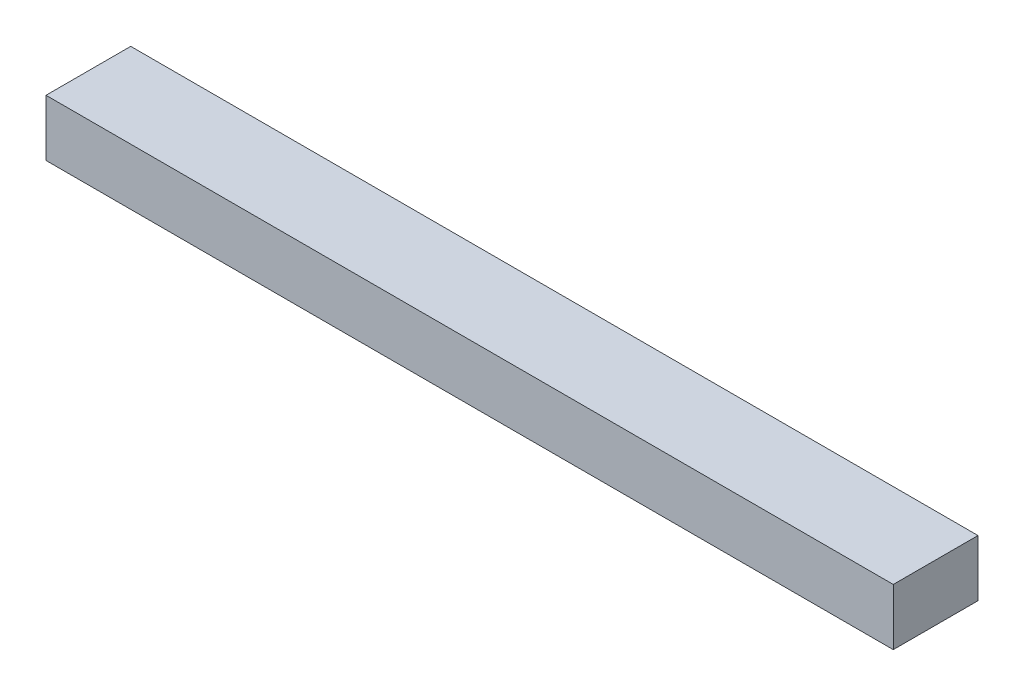
ISO-10303-21;
HEADER;
FILE_DESCRIPTION(('STEP AP214'),'2;1');
FILE_NAME('part.step','',(''),(''),'','','');
FILE_SCHEMA(('AUTOMOTIVE_DESIGN { 1 0 10303 214 1 1 1 1 }'));
ENDSEC;
DATA;
#1=APPLICATION_CONTEXT('core data for automotive mechanical design processes');
#2=APPLICATION_PROTOCOL_DEFINITION('international standard','automotive_design',2000,#1);
#3=PRODUCT_CONTEXT('',#1,'mechanical');
#4=PRODUCT('Part','Part','',(#3));
#5=PRODUCT_RELATED_PRODUCT_CATEGORY('part','',(#4));
#6=PRODUCT_DEFINITION_FORMATION('','',#4);
#7=PRODUCT_DEFINITION_CONTEXT('part definition',#1,'design');
#8=PRODUCT_DEFINITION('design','',#6,#7);
#9=PRODUCT_DEFINITION_SHAPE('','',#8);
#10=(LENGTH_UNIT() NAMED_UNIT(*) SI_UNIT(.MILLI.,.METRE.));
#11=(NAMED_UNIT(*) PLANE_ANGLE_UNIT() SI_UNIT($,.RADIAN.));
#12=(NAMED_UNIT(*) SI_UNIT($,.STERADIAN.) SOLID_ANGLE_UNIT());
#13=UNCERTAINTY_MEASURE_WITH_UNIT(LENGTH_MEASURE(1.E-05),#10,'distance_accuracy_value','');
#14=(GEOMETRIC_REPRESENTATION_CONTEXT(3) GLOBAL_UNCERTAINTY_ASSIGNED_CONTEXT((#13)) GLOBAL_UNIT_ASSIGNED_CONTEXT((#10,
#11,#12)) REPRESENTATION_CONTEXT('',''));
#15=CARTESIAN_POINT('',(0.,0.,0.));
#16=DIRECTION('',(0.,0.,1.));
#17=DIRECTION('',(1.,0.,0.));
#18=AXIS2_PLACEMENT_3D('',#15,#16,#17);
#19=CARTESIAN_POINT('',(0.,12.7,0.));
#20=DIRECTION('',(1.,0.,0.));
#21=DIRECTION('',(0.,0.,-1.));
#22=AXIS2_PLACEMENT_3D('',#19,#20,#21);
#23=PLANE('',#22);
#24=DIRECTION('',(0.,0.,1.));
#25=VECTOR('',#24,1.);
#26=CARTESIAN_POINT('',(0.,0.,0.));
#27=LINE('',#26,#25);
#28=CARTESIAN_POINT('',(0.,0.,-19.05));
#29=VERTEX_POINT('',#28);
#30=CARTESIAN_POINT('',(0.,0.,0.));
#31=VERTEX_POINT('',#30);
#32=EDGE_CURVE('E97',#29,#31,#27,.T.);
#33=ORIENTED_EDGE('',*,*,#32,.T.);
#34=DIRECTION('',(0.,-1.,0.));
#35=VECTOR('',#34,1.);
#36=CARTESIAN_POINT('',(0.,12.7,0.));
#37=LINE('',#36,#35);
#38=CARTESIAN_POINT('',(0.,12.7,0.));
#39=VERTEX_POINT('',#38);
#40=EDGE_CURVE('E11',#39,#31,#37,.T.);
#41=ORIENTED_EDGE('',*,*,#40,.F.);
#42=DIRECTION('',(0.,0.,1.));
#43=VECTOR('',#42,1.);
#44=CARTESIAN_POINT('',(0.,12.7,0.));
#45=LINE('',#44,#43);
#46=CARTESIAN_POINT('',(0.,12.7,-19.05));
#47=VERTEX_POINT('',#46);
#48=EDGE_CURVE('E85',#47,#39,#45,.T.);
#49=ORIENTED_EDGE('',*,*,#48,.F.);
#50=DIRECTION('',(0.,-1.,0.));
#51=VECTOR('',#50,1.);
#52=CARTESIAN_POINT('',(0.,12.7,-19.05));
#53=LINE('',#52,#51);
#54=EDGE_CURVE('E93',#47,#29,#53,.T.);
#55=ORIENTED_EDGE('',*,*,#54,.T.);
#56=EDGE_LOOP('',(#33,#41,#49,#55));
#57=FACE_BOUND('',#56,.T.);
#58=ADVANCED_FACE('F34',(#57),#23,.F.);
#59=CARTESIAN_POINT('',(0.,12.7,0.));
#60=DIRECTION('',(0.,0.,-1.));
#61=DIRECTION('',(-1.,0.,0.));
#62=AXIS2_PLACEMENT_3D('',#59,#60,#61);
#63=PLANE('',#62);
#64=DIRECTION('',(1.,0.,0.));
#65=VECTOR('',#64,1.);
#66=CARTESIAN_POINT('',(0.,0.,0.));
#67=LINE('',#66,#65);
#68=CARTESIAN_POINT('',(190.5,0.,0.));
#69=VERTEX_POINT('',#68);
#70=EDGE_CURVE('E89',#31,#69,#67,.T.);
#71=ORIENTED_EDGE('',*,*,#70,.T.);
#72=DIRECTION('',(0.,-1.,0.));
#73=VECTOR('',#72,1.);
#74=CARTESIAN_POINT('',(190.5,12.7,0.));
#75=LINE('',#74,#73);
#76=CARTESIAN_POINT('',(190.5,12.7,0.));
#77=VERTEX_POINT('',#76);
#78=EDGE_CURVE('E42',#77,#69,#75,.T.);
#79=ORIENTED_EDGE('',*,*,#78,.F.);
#80=DIRECTION('',(1.,0.,0.));
#81=VECTOR('',#80,1.);
#82=CARTESIAN_POINT('',(0.,12.7,0.));
#83=LINE('',#82,#81);
#84=EDGE_CURVE('E80',#39,#77,#83,.T.);
#85=ORIENTED_EDGE('',*,*,#84,.F.);
#86=ORIENTED_EDGE('',*,*,#40,.T.);
#87=EDGE_LOOP('',(#71,#79,#85,#86));
#88=FACE_BOUND('',#87,.T.);
#89=ADVANCED_FACE('F88',(#88),#63,.F.);
#90=CARTESIAN_POINT('',(190.5,12.7,0.));
#91=DIRECTION('',(-1.,0.,0.));
#92=DIRECTION('',(0.,0.,1.));
#93=AXIS2_PLACEMENT_3D('',#90,#91,#92);
#94=PLANE('',#93);
#95=DIRECTION('',(0.,0.,-1.));
#96=VECTOR('',#95,1.);
#97=CARTESIAN_POINT('',(190.5,0.,0.));
#98=LINE('',#97,#96);
#99=CARTESIAN_POINT('',(190.5,0.,-19.05));
#100=VERTEX_POINT('',#99);
#101=EDGE_CURVE('E67',#69,#100,#98,.T.);
#102=ORIENTED_EDGE('',*,*,#101,.T.);
#103=DIRECTION('',(0.,-1.,0.));
#104=VECTOR('',#103,1.);
#105=CARTESIAN_POINT('',(190.5,12.7,-19.05));
#106=LINE('',#105,#104);
#107=CARTESIAN_POINT('',(190.5,12.7,-19.05));
#108=VERTEX_POINT('',#107);
#109=EDGE_CURVE('E90',#108,#100,#106,.T.);
#110=ORIENTED_EDGE('',*,*,#109,.F.);
#111=DIRECTION('',(0.,0.,-1.));
#112=VECTOR('',#111,1.);
#113=CARTESIAN_POINT('',(190.5,12.7,0.));
#114=LINE('',#113,#112);
#115=EDGE_CURVE('E83',#77,#108,#114,.T.);
#116=ORIENTED_EDGE('',*,*,#115,.F.);
#117=ORIENTED_EDGE('',*,*,#78,.T.);
#118=EDGE_LOOP('',(#102,#110,#116,#117));
#119=FACE_BOUND('',#118,.T.);
#120=ADVANCED_FACE('F91',(#119),#94,.F.);
#121=CARTESIAN_POINT('',(0.,12.7,-19.05));
#122=DIRECTION('',(0.,0.,1.));
#123=DIRECTION('',(1.,0.,0.));
#124=AXIS2_PLACEMENT_3D('',#121,#122,#123);
#125=PLANE('',#124);
#126=DIRECTION('',(-1.,0.,0.));
#127=VECTOR('',#126,1.);
#128=CARTESIAN_POINT('',(0.,0.,-19.05));
#129=LINE('',#128,#127);
#130=EDGE_CURVE('E73',#100,#29,#129,.T.);
#131=ORIENTED_EDGE('',*,*,#130,.T.);
#132=ORIENTED_EDGE('',*,*,#54,.F.);
#133=DIRECTION('',(-1.,0.,0.));
#134=VECTOR('',#133,1.);
#135=CARTESIAN_POINT('',(0.,12.7,-19.05));
#136=LINE('',#135,#134);
#137=EDGE_CURVE('E50',#108,#47,#136,.T.);
#138=ORIENTED_EDGE('',*,*,#137,.F.);
#139=ORIENTED_EDGE('',*,*,#109,.T.);
#140=EDGE_LOOP('',(#131,#132,#138,#139));
#141=FACE_BOUND('',#140,.T.);
#142=ADVANCED_FACE('F104',(#141),#125,.F.);
#143=CARTESIAN_POINT('',(0.,12.7,0.));
#144=DIRECTION('',(0.,-1.,0.));
#145=DIRECTION('',(0.,0.,-1.));
#146=AXIS2_PLACEMENT_3D('',#143,#144,#145);
#147=PLANE('',#146);
#148=ORIENTED_EDGE('',*,*,#48,.T.);
#149=ORIENTED_EDGE('',*,*,#84,.T.);
#150=ORIENTED_EDGE('',*,*,#115,.T.);
#151=ORIENTED_EDGE('',*,*,#137,.T.);
#152=EDGE_LOOP('',(#148,#149,#150,#151));
#153=FACE_BOUND('',#152,.T.);
#154=ADVANCED_FACE('F81',(#153),#147,.F.);
#155=CARTESIAN_POINT('',(0.,0.,0.));
#156=DIRECTION('',(0.,-1.,0.));
#157=DIRECTION('',(0.,0.,-1.));
#158=AXIS2_PLACEMENT_3D('',#155,#156,#157);
#159=PLANE('',#158);
#160=ORIENTED_EDGE('',*,*,#32,.F.);
#161=ORIENTED_EDGE('',*,*,#130,.F.);
#162=ORIENTED_EDGE('',*,*,#101,.F.);
#163=ORIENTED_EDGE('',*,*,#70,.F.);
#164=EDGE_LOOP('',(#160,#161,#162,#163));
#165=FACE_BOUND('',#164,.T.);
#166=ADVANCED_FACE('F107',(#165),#159,.T.);
#167=CLOSED_SHELL('',(#58,#89,#120,#142,#154,#166));
#168=MANIFOLD_SOLID_BREP('B2',#167);
#169=ADVANCED_BREP_SHAPE_REPRESENTATION('',(#18,#168),#14);
#170=SHAPE_DEFINITION_REPRESENTATION(#9,#169);
ENDSEC;
END-ISO-10303-21;
